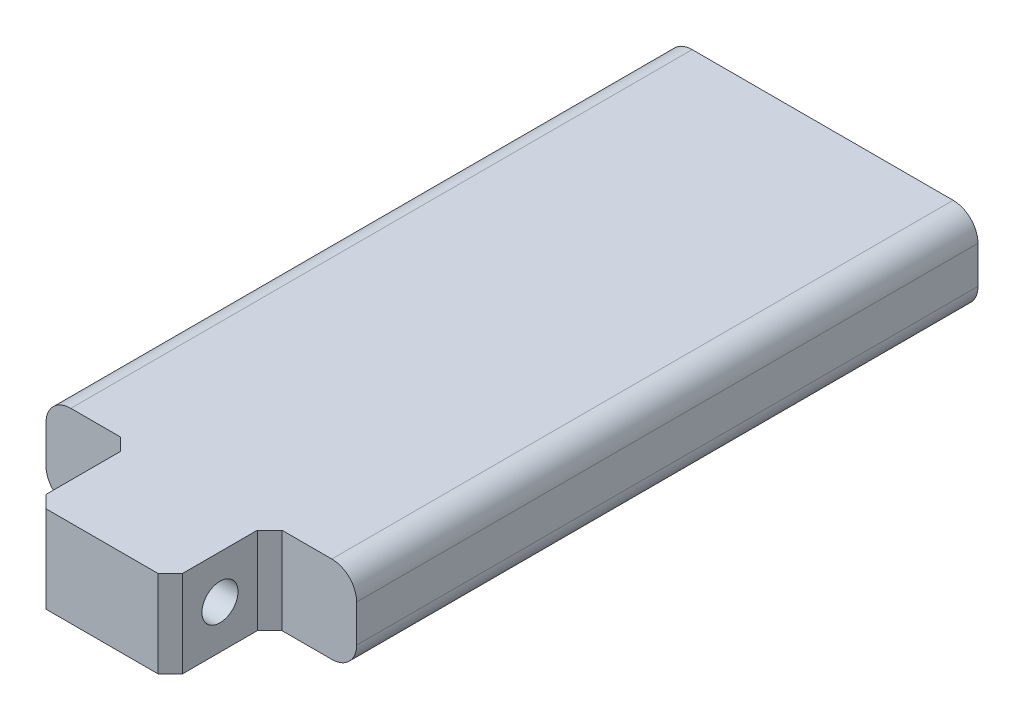
ISO-10303-21;
HEADER;
FILE_DESCRIPTION(('STEP AP214'),'2;1');
FILE_NAME('part.step','',(''),(''),'','','');
FILE_SCHEMA(('AUTOMOTIVE_DESIGN { 1 0 10303 214 1 1 1 1 }'));
ENDSEC;
DATA;
#1=APPLICATION_CONTEXT('core data for automotive mechanical design processes');
#2=APPLICATION_PROTOCOL_DEFINITION('international standard','automotive_design',2000,#1);
#3=PRODUCT_CONTEXT('',#1,'mechanical');
#4=PRODUCT('Part','Part','',(#3));
#5=PRODUCT_RELATED_PRODUCT_CATEGORY('part','',(#4));
#6=PRODUCT_DEFINITION_FORMATION('','',#4);
#7=PRODUCT_DEFINITION_CONTEXT('part definition',#1,'design');
#8=PRODUCT_DEFINITION('design','',#6,#7);
#9=PRODUCT_DEFINITION_SHAPE('','',#8);
#10=(LENGTH_UNIT() NAMED_UNIT(*) SI_UNIT(.MILLI.,.METRE.));
#11=(NAMED_UNIT(*) PLANE_ANGLE_UNIT() SI_UNIT($,.RADIAN.));
#12=(NAMED_UNIT(*) SI_UNIT($,.STERADIAN.) SOLID_ANGLE_UNIT());
#13=UNCERTAINTY_MEASURE_WITH_UNIT(LENGTH_MEASURE(1.E-05),#10,'distance_accuracy_value','');
#14=(GEOMETRIC_REPRESENTATION_CONTEXT(3) GLOBAL_UNCERTAINTY_ASSIGNED_CONTEXT((#13)) GLOBAL_UNIT_ASSIGNED_CONTEXT((#10,
#11,#12)) REPRESENTATION_CONTEXT('',''));
#15=CARTESIAN_POINT('',(0.,0.,0.));
#16=DIRECTION('',(0.,0.,1.));
#17=DIRECTION('',(1.,0.,0.));
#18=AXIS2_PLACEMENT_3D('',#15,#16,#17);
#19=CARTESIAN_POINT('',(12.5,-3.5,58.));
#20=DIRECTION('',(-1.,0.,0.));
#21=DIRECTION('',(0.,0.,1.));
#22=AXIS2_PLACEMENT_3D('',#19,#20,#21);
#23=PLANE('',#22);
#24=DIRECTION('',(0.,1.,0.));
#25=VECTOR('',#24,1.);
#26=CARTESIAN_POINT('',(12.5,-3.5,0.));
#27=LINE('',#26,#25);
#28=CARTESIAN_POINT('',(12.5,-1.5,0.));
#29=VERTEX_POINT('',#28);
#30=CARTESIAN_POINT('',(12.5,1.5,0.));
#31=VERTEX_POINT('',#30);
#32=EDGE_CURVE('E201',#29,#31,#27,.T.);
#33=ORIENTED_EDGE('',*,*,#32,.T.);
#34=DIRECTION('',(0.,0.,-1.));
#35=VECTOR('',#34,1.);
#36=CARTESIAN_POINT('',(12.5,1.5,58.));
#37=LINE('',#36,#35);
#38=CARTESIAN_POINT('',(12.5,1.5,50.));
#39=VERTEX_POINT('',#38);
#40=EDGE_CURVE('E256',#31,#39,#37,.F.);
#41=ORIENTED_EDGE('',*,*,#40,.T.);
#42=DIRECTION('',(0.,1.,0.));
#43=VECTOR('',#42,1.);
#44=CARTESIAN_POINT('',(12.5,-3.5,50.));
#45=LINE('',#44,#43);
#46=CARTESIAN_POINT('',(12.5,-1.5,50.));
#47=VERTEX_POINT('',#46);
#48=EDGE_CURVE('E184',#47,#39,#45,.T.);
#49=ORIENTED_EDGE('',*,*,#48,.F.);
#50=DIRECTION('',(0.,0.,-1.));
#51=VECTOR('',#50,1.);
#52=CARTESIAN_POINT('',(12.5,-1.5,58.));
#53=LINE('',#52,#51);
#54=EDGE_CURVE('E253',#47,#29,#53,.T.);
#55=ORIENTED_EDGE('',*,*,#54,.T.);
#56=EDGE_LOOP('',(#33,#41,#49,#55));
#57=FACE_BOUND('',#56,.T.);
#58=ADVANCED_FACE('F37',(#57),#23,.F.);
#59=CARTESIAN_POINT('',(-12.5,3.5,58.));
#60=DIRECTION('',(0.,-1.,0.));
#61=DIRECTION('',(0.,0.,-1.));
#62=AXIS2_PLACEMENT_3D('',#59,#60,#61);
#63=PLANE('',#62);
#64=DIRECTION('',(-1.,0.,0.));
#65=VECTOR('',#64,1.);
#66=CARTESIAN_POINT('',(12.5,3.5,50.));
#67=LINE('',#66,#65);
#68=CARTESIAN_POINT('',(10.5,3.5,50.));
#69=VERTEX_POINT('',#68);
#70=CARTESIAN_POINT('',(6.5,3.5,50.));
#71=VERTEX_POINT('',#70);
#72=EDGE_CURVE('E177',#69,#71,#67,.T.);
#73=ORIENTED_EDGE('',*,*,#72,.F.);
#74=DIRECTION('',(0.,0.,-1.));
#75=VECTOR('',#74,1.);
#76=CARTESIAN_POINT('',(10.5,3.5,58.));
#77=LINE('',#76,#75);
#78=CARTESIAN_POINT('',(10.5,3.5,0.));
#79=VERTEX_POINT('',#78);
#80=EDGE_CURVE('E242',#69,#79,#77,.T.);
#81=ORIENTED_EDGE('',*,*,#80,.T.);
#82=DIRECTION('',(-1.,0.,0.));
#83=VECTOR('',#82,1.);
#84=CARTESIAN_POINT('',(-12.5,3.5,0.));
#85=LINE('',#84,#83);
#86=CARTESIAN_POINT('',(-10.5,3.5,0.));
#87=VERTEX_POINT('',#86);
#88=EDGE_CURVE('E212',#79,#87,#85,.T.);
#89=ORIENTED_EDGE('',*,*,#88,.T.);
#90=DIRECTION('',(0.,0.,-1.));
#91=VECTOR('',#90,1.);
#92=CARTESIAN_POINT('',(-10.5,3.5,58.));
#93=LINE('',#92,#91);
#94=CARTESIAN_POINT('',(-10.5,3.5,50.));
#95=VERTEX_POINT('',#94);
#96=EDGE_CURVE('E239',#87,#95,#93,.F.);
#97=ORIENTED_EDGE('',*,*,#96,.T.);
#98=DIRECTION('',(-1.,0.,0.));
#99=VECTOR('',#98,1.);
#100=CARTESIAN_POINT('',(-12.5,3.5,50.));
#101=LINE('',#100,#99);
#102=CARTESIAN_POINT('',(-6.50000000000001,3.5,50.));
#103=VERTEX_POINT('',#102);
#104=EDGE_CURVE('E194',#103,#95,#101,.T.);
#105=ORIENTED_EDGE('',*,*,#104,.F.);
#106=DIRECTION('',(-0.707106781186547,0.,-0.707106781186547));
#107=VECTOR('',#106,1.);
#108=CARTESIAN_POINT('',(-5.5,3.5,51.));
#109=LINE('',#108,#107);
#110=CARTESIAN_POINT('',(-5.5,3.5,51.));
#111=VERTEX_POINT('',#110);
#112=EDGE_CURVE('E45',#103,#111,#109,.F.);
#113=ORIENTED_EDGE('',*,*,#112,.T.);
#114=DIRECTION('',(0.,0.,-1.));
#115=VECTOR('',#114,1.);
#116=CARTESIAN_POINT('',(-5.5,3.5,58.));
#117=LINE('',#116,#115);
#118=CARTESIAN_POINT('',(-5.5,3.5,57.));
#119=VERTEX_POINT('',#118);
#120=EDGE_CURVE('E190',#119,#111,#117,.T.);
#121=ORIENTED_EDGE('',*,*,#120,.F.);
#122=DIRECTION('',(-0.707106781186553,0.,-0.707106781186543));
#123=VECTOR('',#122,1.);
#124=CARTESIAN_POINT('',(-5.5,3.5,57.));
#125=LINE('',#124,#123);
#126=CARTESIAN_POINT('',(-4.49999999999999,3.5,58.));
#127=VERTEX_POINT('',#126);
#128=EDGE_CURVE('E224',#119,#127,#125,.F.);
#129=ORIENTED_EDGE('',*,*,#128,.T.);
#130=DIRECTION('',(-1.,0.,0.));
#131=VECTOR('',#130,1.);
#132=CARTESIAN_POINT('',(-12.5,3.5,58.));
#133=LINE('',#132,#131);
#134=CARTESIAN_POINT('',(4.50000000000001,3.5,58.));
#135=VERTEX_POINT('',#134);
#136=EDGE_CURVE('E202',#135,#127,#133,.T.);
#137=ORIENTED_EDGE('',*,*,#136,.F.);
#138=DIRECTION('',(-0.707106781186545,0.,0.70710678118655));
#139=VECTOR('',#138,1.);
#140=CARTESIAN_POINT('',(4.50000000000001,3.5,58.));
#141=LINE('',#140,#139);
#142=CARTESIAN_POINT('',(5.5,3.5,57.));
#143=VERTEX_POINT('',#142);
#144=EDGE_CURVE('E226',#135,#143,#141,.F.);
#145=ORIENTED_EDGE('',*,*,#144,.T.);
#146=DIRECTION('',(0.,0.,1.));
#147=VECTOR('',#146,1.);
#148=CARTESIAN_POINT('',(5.5,3.5,58.));
#149=LINE('',#148,#147);
#150=CARTESIAN_POINT('',(5.5,3.5,51.));
#151=VERTEX_POINT('',#150);
#152=EDGE_CURVE('E182',#151,#143,#149,.T.);
#153=ORIENTED_EDGE('',*,*,#152,.F.);
#154=DIRECTION('',(-0.707106781186543,0.,0.707106781186553));
#155=VECTOR('',#154,1.);
#156=CARTESIAN_POINT('',(-6.99999999999986,3.5,63.5000000000001));
#157=LINE('',#156,#155);
#158=EDGE_CURVE('E286',#151,#71,#157,.F.);
#159=ORIENTED_EDGE('',*,*,#158,.T.);
#160=EDGE_LOOP('',(#73,#81,#89,#97,#105,#113,#121,#129,#137,#145,#153,#159));
#161=FACE_BOUND('',#160,.T.);
#162=ADVANCED_FACE('F304',(#161),#63,.F.);
#163=CARTESIAN_POINT('',(-12.5,-3.5,58.));
#164=DIRECTION('',(1.,0.,0.));
#165=DIRECTION('',(0.,0.,-1.));
#166=AXIS2_PLACEMENT_3D('',#163,#164,#165);
#167=PLANE('',#166);
#168=DIRECTION('',(0.,1.,0.));
#169=VECTOR('',#168,1.);
#170=CARTESIAN_POINT('',(-12.5,-3.5,50.));
#171=LINE('',#170,#169);
#172=CARTESIAN_POINT('',(-12.5,-1.5,50.));
#173=VERTEX_POINT('',#172);
#174=CARTESIAN_POINT('',(-12.5,1.5,50.));
#175=VERTEX_POINT('',#174);
#176=EDGE_CURVE('E196',#173,#175,#171,.T.);
#177=ORIENTED_EDGE('',*,*,#176,.T.);
#178=DIRECTION('',(0.,0.,-1.));
#179=VECTOR('',#178,1.);
#180=CARTESIAN_POINT('',(-12.5,1.5,58.));
#181=LINE('',#180,#179);
#182=CARTESIAN_POINT('',(-12.5,1.5,0.));
#183=VERTEX_POINT('',#182);
#184=EDGE_CURVE('E269',#175,#183,#181,.T.);
#185=ORIENTED_EDGE('',*,*,#184,.T.);
#186=DIRECTION('',(0.,-1.,0.));
#187=VECTOR('',#186,1.);
#188=CARTESIAN_POINT('',(-12.5,-3.5,0.));
#189=LINE('',#188,#187);
#190=CARTESIAN_POINT('',(-12.5,-1.5,0.));
#191=VERTEX_POINT('',#190);
#192=EDGE_CURVE('E215',#183,#191,#189,.T.);
#193=ORIENTED_EDGE('',*,*,#192,.T.);
#194=DIRECTION('',(0.,0.,-1.));
#195=VECTOR('',#194,1.);
#196=CARTESIAN_POINT('',(-12.5,-1.5,58.));
#197=LINE('',#196,#195);
#198=EDGE_CURVE('E267',#191,#173,#197,.F.);
#199=ORIENTED_EDGE('',*,*,#198,.T.);
#200=EDGE_LOOP('',(#177,#185,#193,#199));
#201=FACE_BOUND('',#200,.T.);
#202=ADVANCED_FACE('F324',(#201),#167,.F.);
#203=CARTESIAN_POINT('',(-12.5,-3.5,58.));
#204=DIRECTION('',(0.,1.,0.));
#205=DIRECTION('',(0.,0.,1.));
#206=AXIS2_PLACEMENT_3D('',#203,#204,#205);
#207=PLANE('',#206);
#208=DIRECTION('',(1.,0.,0.));
#209=VECTOR('',#208,1.);
#210=CARTESIAN_POINT('',(-12.5,-3.5,0.));
#211=LINE('',#210,#209);
#212=CARTESIAN_POINT('',(-10.5,-3.5,0.));
#213=VERTEX_POINT('',#212);
#214=CARTESIAN_POINT('',(10.5,-3.5,0.));
#215=VERTEX_POINT('',#214);
#216=EDGE_CURVE('E206',#213,#215,#211,.T.);
#217=ORIENTED_EDGE('',*,*,#216,.T.);
#218=DIRECTION('',(0.,0.,-1.));
#219=VECTOR('',#218,1.);
#220=CARTESIAN_POINT('',(10.5,-3.5,58.));
#221=LINE('',#220,#219);
#222=CARTESIAN_POINT('',(10.5,-3.5,50.));
#223=VERTEX_POINT('',#222);
#224=EDGE_CURVE('E265',#215,#223,#221,.F.);
#225=ORIENTED_EDGE('',*,*,#224,.T.);
#226=DIRECTION('',(-1.,0.,0.));
#227=VECTOR('',#226,1.);
#228=CARTESIAN_POINT('',(12.5,-3.5,50.));
#229=LINE('',#228,#227);
#230=CARTESIAN_POINT('',(6.5,-3.5,50.));
#231=VERTEX_POINT('',#230);
#232=EDGE_CURVE('E178',#223,#231,#229,.T.);
#233=ORIENTED_EDGE('',*,*,#232,.T.);
#234=DIRECTION('',(0.707106781186543,0.,-0.707106781186553));
#235=VECTOR('',#234,1.);
#236=CARTESIAN_POINT('',(-6.99999999999986,-3.5,63.5000000000001));
#237=LINE('',#236,#235);
#238=CARTESIAN_POINT('',(5.5,-3.5,51.));
#239=VERTEX_POINT('',#238);
#240=EDGE_CURVE('E288',#231,#239,#237,.F.);
#241=ORIENTED_EDGE('',*,*,#240,.T.);
#242=DIRECTION('',(0.,0.,1.));
#243=VECTOR('',#242,1.);
#244=CARTESIAN_POINT('',(5.5,-3.5,58.));
#245=LINE('',#244,#243);
#246=CARTESIAN_POINT('',(5.5,-3.5,57.));
#247=VERTEX_POINT('',#246);
#248=EDGE_CURVE('E181',#239,#247,#245,.T.);
#249=ORIENTED_EDGE('',*,*,#248,.T.);
#250=DIRECTION('',(0.707106781186545,0.,-0.70710678118655));
#251=VECTOR('',#250,1.);
#252=CARTESIAN_POINT('',(4.50000000000001,-3.5,58.));
#253=LINE('',#252,#251);
#254=CARTESIAN_POINT('',(4.50000000000001,-3.5,58.));
#255=VERTEX_POINT('',#254);
#256=EDGE_CURVE('E234',#247,#255,#253,.F.);
#257=ORIENTED_EDGE('',*,*,#256,.T.);
#258=DIRECTION('',(1.,0.,0.));
#259=VECTOR('',#258,1.);
#260=CARTESIAN_POINT('',(-12.5,-3.5,58.));
#261=LINE('',#260,#259);
#262=CARTESIAN_POINT('',(-4.49999999999999,-3.5,58.));
#263=VERTEX_POINT('',#262);
#264=EDGE_CURVE('E205',#263,#255,#261,.T.);
#265=ORIENTED_EDGE('',*,*,#264,.F.);
#266=DIRECTION('',(0.707106781186553,0.,0.707106781186543));
#267=VECTOR('',#266,1.);
#268=CARTESIAN_POINT('',(-5.5,-3.5,57.));
#269=LINE('',#268,#267);
#270=CARTESIAN_POINT('',(-5.5,-3.5,57.));
#271=VERTEX_POINT('',#270);
#272=EDGE_CURVE('E232',#263,#271,#269,.F.);
#273=ORIENTED_EDGE('',*,*,#272,.T.);
#274=DIRECTION('',(0.,0.,-1.));
#275=VECTOR('',#274,1.);
#276=CARTESIAN_POINT('',(-5.5,-3.5,58.));
#277=LINE('',#276,#275);
#278=CARTESIAN_POINT('',(-5.5,-3.5,51.));
#279=VERTEX_POINT('',#278);
#280=EDGE_CURVE('E191',#271,#279,#277,.T.);
#281=ORIENTED_EDGE('',*,*,#280,.T.);
#282=DIRECTION('',(0.707106781186547,0.,0.707106781186547));
#283=VECTOR('',#282,1.);
#284=CARTESIAN_POINT('',(-5.5,-3.5,51.));
#285=LINE('',#284,#283);
#286=CARTESIAN_POINT('',(-6.50000000000001,-3.5,50.));
#287=VERTEX_POINT('',#286);
#288=EDGE_CURVE('E11',#279,#287,#285,.F.);
#289=ORIENTED_EDGE('',*,*,#288,.T.);
#290=DIRECTION('',(-1.,0.,0.));
#291=VECTOR('',#290,1.);
#292=CARTESIAN_POINT('',(-12.5,-3.5,50.));
#293=LINE('',#292,#291);
#294=CARTESIAN_POINT('',(-10.5,-3.5,50.));
#295=VERTEX_POINT('',#294);
#296=EDGE_CURVE('E193',#287,#295,#293,.T.);
#297=ORIENTED_EDGE('',*,*,#296,.T.);
#298=DIRECTION('',(0.,0.,-1.));
#299=VECTOR('',#298,1.);
#300=CARTESIAN_POINT('',(-10.5,-3.5,58.));
#301=LINE('',#300,#299);
#302=EDGE_CURVE('E262',#295,#213,#301,.T.);
#303=ORIENTED_EDGE('',*,*,#302,.T.);
#304=EDGE_LOOP('',(#217,#225,#233,#241,#249,#257,#265,#273,#281,#289,#297,#303));
#305=FACE_BOUND('',#304,.T.);
#306=ADVANCED_FACE('F292',(#305),#207,.F.);
#307=CARTESIAN_POINT('',(0.,0.,58.));
#308=DIRECTION('',(0.,0.,-1.));
#309=DIRECTION('',(-1.,0.,0.));
#310=AXIS2_PLACEMENT_3D('',#307,#308,#309);
#311=PLANE('',#310);
#312=ORIENTED_EDGE('',*,*,#264,.T.);
#313=DIRECTION('',(0.,1.,0.));
#314=VECTOR('',#313,1.);
#315=CARTESIAN_POINT('',(4.50000000000001,0.,58.));
#316=LINE('',#315,#314);
#317=EDGE_CURVE('E221',#255,#135,#316,.T.);
#318=ORIENTED_EDGE('',*,*,#317,.T.);
#319=ORIENTED_EDGE('',*,*,#136,.T.);
#320=DIRECTION('',(0.,-1.,0.));
#321=VECTOR('',#320,1.);
#322=CARTESIAN_POINT('',(-4.49999999999999,0.,58.));
#323=LINE('',#322,#321);
#324=EDGE_CURVE('E209',#127,#263,#323,.T.);
#325=ORIENTED_EDGE('',*,*,#324,.T.);
#326=EDGE_LOOP('',(#312,#318,#319,#325));
#327=FACE_BOUND('',#326,.T.);
#328=ADVANCED_FACE('F381',(#327),#311,.F.);
#329=CARTESIAN_POINT('',(0.,0.,0.));
#330=DIRECTION('',(0.,0.,-1.));
#331=DIRECTION('',(-1.,0.,0.));
#332=AXIS2_PLACEMENT_3D('',#329,#330,#331);
#333=PLANE('',#332);
#334=CARTESIAN_POINT('',(7.,0.,0.));
#335=DIRECTION('',(0.,0.,-1.));
#336=DIRECTION('',(-1.,0.,0.));
#337=AXIS2_PLACEMENT_3D('',#334,#335,#336);
#338=CIRCLE('',#337,1.5);
#339=CARTESIAN_POINT('',(5.5,0.,0.));
#340=VERTEX_POINT('',#339);
#341=EDGE_CURVE('E165',#340,#340,#338,.T.);
#342=ORIENTED_EDGE('',*,*,#341,.F.);
#343=EDGE_LOOP('',(#342));
#344=FACE_BOUND('',#343,.T.);
#345=CARTESIAN_POINT('',(-7.,0.,0.));
#346=DIRECTION('',(0.,0.,-1.));
#347=DIRECTION('',(-1.,0.,0.));
#348=AXIS2_PLACEMENT_3D('',#345,#346,#347);
#349=CIRCLE('',#348,1.5);
#350=CARTESIAN_POINT('',(-8.5,0.,0.));
#351=VERTEX_POINT('',#350);
#352=EDGE_CURVE('E164',#351,#351,#349,.T.);
#353=ORIENTED_EDGE('',*,*,#352,.F.);
#354=EDGE_LOOP('',(#353));
#355=FACE_BOUND('',#354,.T.);
#356=ORIENTED_EDGE('',*,*,#88,.F.);
#357=CARTESIAN_POINT('',(10.5,1.5,0.));
#358=DIRECTION('',(0.,0.,-1.));
#359=DIRECTION('',(-1.,0.,0.));
#360=AXIS2_PLACEMENT_3D('',#357,#358,#359);
#361=CIRCLE('',#360,2.);
#362=EDGE_CURVE('E251',#79,#31,#361,.T.);
#363=ORIENTED_EDGE('',*,*,#362,.T.);
#364=ORIENTED_EDGE('',*,*,#32,.F.);
#365=CARTESIAN_POINT('',(10.5,-1.5,0.));
#366=DIRECTION('',(0.,0.,-1.));
#367=DIRECTION('',(-1.,0.,0.));
#368=AXIS2_PLACEMENT_3D('',#365,#366,#367);
#369=CIRCLE('',#368,2.);
#370=EDGE_CURVE('E249',#29,#215,#369,.T.);
#371=ORIENTED_EDGE('',*,*,#370,.T.);
#372=ORIENTED_EDGE('',*,*,#216,.F.);
#373=CARTESIAN_POINT('',(-10.5,-1.5,0.));
#374=DIRECTION('',(0.,0.,-1.));
#375=DIRECTION('',(-1.,0.,0.));
#376=AXIS2_PLACEMENT_3D('',#373,#374,#375);
#377=CIRCLE('',#376,2.);
#378=EDGE_CURVE('E245',#213,#191,#377,.T.);
#379=ORIENTED_EDGE('',*,*,#378,.T.);
#380=ORIENTED_EDGE('',*,*,#192,.F.);
#381=CARTESIAN_POINT('',(-10.5,1.5,0.));
#382=DIRECTION('',(0.,0.,-1.));
#383=DIRECTION('',(-1.,0.,0.));
#384=AXIS2_PLACEMENT_3D('',#381,#382,#383);
#385=CIRCLE('',#384,2.);
#386=EDGE_CURVE('E247',#183,#87,#385,.T.);
#387=ORIENTED_EDGE('',*,*,#386,.T.);
#388=EDGE_LOOP('',(#356,#363,#364,#371,#372,#379,#380,#387));
#389=FACE_BOUND('',#388,.T.);
#390=ADVANCED_FACE('F316',(#344,#355,#389),#333,.T.);
#391=CARTESIAN_POINT('',(-12.5,-3.5,50.));
#392=DIRECTION('',(0.,0.,-1.));
#393=DIRECTION('',(-1.,0.,0.));
#394=AXIS2_PLACEMENT_3D('',#391,#392,#393);
#395=PLANE('',#394);
#396=ORIENTED_EDGE('',*,*,#296,.F.);
#397=DIRECTION('',(0.,1.,0.));
#398=VECTOR('',#397,1.);
#399=CARTESIAN_POINT('',(-6.50000000000001,3.5,50.));
#400=LINE('',#399,#398);
#401=EDGE_CURVE('E282',#287,#103,#400,.T.);
#402=ORIENTED_EDGE('',*,*,#401,.T.);
#403=ORIENTED_EDGE('',*,*,#104,.T.);
#404=CARTESIAN_POINT('',(-10.5,1.5,50.));
#405=DIRECTION('',(0.,0.,-1.));
#406=DIRECTION('',(-1.,0.,0.));
#407=AXIS2_PLACEMENT_3D('',#404,#405,#406);
#408=CIRCLE('',#407,2.);
#409=EDGE_CURVE('E275',#95,#175,#408,.F.);
#410=ORIENTED_EDGE('',*,*,#409,.T.);
#411=ORIENTED_EDGE('',*,*,#176,.F.);
#412=CARTESIAN_POINT('',(-10.5,-1.5,50.));
#413=DIRECTION('',(0.,0.,-1.));
#414=DIRECTION('',(-1.,0.,0.));
#415=AXIS2_PLACEMENT_3D('',#412,#413,#414);
#416=CIRCLE('',#415,2.);
#417=EDGE_CURVE('E272',#173,#295,#416,.F.);
#418=ORIENTED_EDGE('',*,*,#417,.T.);
#419=EDGE_LOOP('',(#396,#402,#403,#410,#411,#418));
#420=FACE_BOUND('',#419,.T.);
#421=ADVANCED_FACE('F330',(#420),#395,.F.);
#422=CARTESIAN_POINT('',(-5.5,-3.5,58.));
#423=DIRECTION('',(1.,0.,0.));
#424=DIRECTION('',(0.,0.,-1.));
#425=AXIS2_PLACEMENT_3D('',#422,#423,#424);
#426=PLANE('',#425);
#427=CARTESIAN_POINT('',(-5.50000000000037,0.,53.9999999999999));
#428=DIRECTION('',(-1.,0.,0.));
#429=DIRECTION('',(0.,0.,1.));
#430=AXIS2_PLACEMENT_3D('',#427,#428,#429);
#431=CIRCLE('',#430,1.45);
#432=CARTESIAN_POINT('',(-5.50000000000037,0.,55.4499999999999));
#433=VERTEX_POINT('',#432);
#434=EDGE_CURVE('E563',#433,#433,#431,.T.);
#435=ORIENTED_EDGE('',*,*,#434,.F.);
#436=EDGE_LOOP('',(#435));
#437=FACE_BOUND('',#436,.T.);
#438=ORIENTED_EDGE('',*,*,#120,.T.);
#439=DIRECTION('',(0.,-1.,0.));
#440=VECTOR('',#439,1.);
#441=CARTESIAN_POINT('',(-5.5,-3.5,51.));
#442=LINE('',#441,#440);
#443=EDGE_CURVE('E58',#111,#279,#442,.T.);
#444=ORIENTED_EDGE('',*,*,#443,.T.);
#445=ORIENTED_EDGE('',*,*,#280,.F.);
#446=DIRECTION('',(0.,1.,0.));
#447=VECTOR('',#446,1.);
#448=CARTESIAN_POINT('',(-5.5,-3.5,57.));
#449=LINE('',#448,#447);
#450=EDGE_CURVE('E236',#271,#119,#449,.T.);
#451=ORIENTED_EDGE('',*,*,#450,.T.);
#452=EDGE_LOOP('',(#438,#444,#445,#451));
#453=FACE_BOUND('',#452,.T.);
#454=ADVANCED_FACE('F377',(#437,#453),#426,.F.);
#455=CARTESIAN_POINT('',(5.5,-3.5,58.));
#456=DIRECTION('',(-1.,0.,0.));
#457=DIRECTION('',(0.,0.,1.));
#458=AXIS2_PLACEMENT_3D('',#455,#456,#457);
#459=PLANE('',#458);
#460=CARTESIAN_POINT('',(5.5,0.,53.9999999999999));
#461=DIRECTION('',(-1.,0.,0.));
#462=DIRECTION('',(0.,0.,1.));
#463=AXIS2_PLACEMENT_3D('',#460,#461,#462);
#464=CIRCLE('',#463,1.45);
#465=CARTESIAN_POINT('',(5.5,0.,55.4499999999999));
#466=VERTEX_POINT('',#465);
#467=EDGE_CURVE('E171',#466,#466,#464,.T.);
#468=ORIENTED_EDGE('',*,*,#467,.T.);
#469=EDGE_LOOP('',(#468));
#470=FACE_BOUND('',#469,.T.);
#471=ORIENTED_EDGE('',*,*,#248,.F.);
#472=DIRECTION('',(0.,1.,0.));
#473=VECTOR('',#472,1.);
#474=CARTESIAN_POINT('',(5.5,3.5,51.));
#475=LINE('',#474,#473);
#476=EDGE_CURVE('E277',#239,#151,#475,.T.);
#477=ORIENTED_EDGE('',*,*,#476,.T.);
#478=ORIENTED_EDGE('',*,*,#152,.T.);
#479=DIRECTION('',(0.,-1.,0.));
#480=VECTOR('',#479,1.);
#481=CARTESIAN_POINT('',(5.5,-3.5,57.));
#482=LINE('',#481,#480);
#483=EDGE_CURVE('E229',#143,#247,#482,.T.);
#484=ORIENTED_EDGE('',*,*,#483,.T.);
#485=EDGE_LOOP('',(#471,#477,#478,#484));
#486=FACE_BOUND('',#485,.T.);
#487=ADVANCED_FACE('F298',(#470,#486),#459,.F.);
#488=CARTESIAN_POINT('',(12.5,-3.5,50.));
#489=DIRECTION('',(0.,0.,-1.));
#490=DIRECTION('',(-1.,0.,0.));
#491=AXIS2_PLACEMENT_3D('',#488,#489,#490);
#492=PLANE('',#491);
#493=ORIENTED_EDGE('',*,*,#72,.T.);
#494=DIRECTION('',(0.,-1.,0.));
#495=VECTOR('',#494,1.);
#496=CARTESIAN_POINT('',(6.5,-3.5,50.));
#497=LINE('',#496,#495);
#498=EDGE_CURVE('E280',#71,#231,#497,.T.);
#499=ORIENTED_EDGE('',*,*,#498,.T.);
#500=ORIENTED_EDGE('',*,*,#232,.F.);
#501=CARTESIAN_POINT('',(10.5,-1.5,50.));
#502=DIRECTION('',(0.,0.,-1.));
#503=DIRECTION('',(-1.,0.,0.));
#504=AXIS2_PLACEMENT_3D('',#501,#502,#503);
#505=CIRCLE('',#504,2.);
#506=EDGE_CURVE('E258',#223,#47,#505,.F.);
#507=ORIENTED_EDGE('',*,*,#506,.T.);
#508=ORIENTED_EDGE('',*,*,#48,.T.);
#509=CARTESIAN_POINT('',(10.5,1.5,50.));
#510=DIRECTION('',(0.,0.,-1.));
#511=DIRECTION('',(-1.,0.,0.));
#512=AXIS2_PLACEMENT_3D('',#509,#510,#511);
#513=CIRCLE('',#512,2.);
#514=EDGE_CURVE('E260',#39,#69,#513,.F.);
#515=ORIENTED_EDGE('',*,*,#514,.T.);
#516=EDGE_LOOP('',(#493,#499,#500,#507,#508,#515));
#517=FACE_BOUND('',#516,.T.);
#518=ADVANCED_FACE('F307',(#517),#492,.F.);
#519=CARTESIAN_POINT('',(-7.,0.,7.5));
#520=DIRECTION('',(0.,0.,-1.));
#521=DIRECTION('',(-1.,0.,0.));
#522=AXIS2_PLACEMENT_3D('',#519,#520,#521);
#523=CONICAL_SURFACE('',#522,1.5,1.02974425867665);
#524=CARTESIAN_POINT('',(-7.,0.,8.40129092854134));
#525=VERTEX_POINT('',#524);
#526=VERTEX_LOOP('',#525);
#527=FACE_BOUND('',#526,.T.);
#528=CARTESIAN_POINT('',(-7.,0.,7.5));
#529=DIRECTION('',(0.,0.,-1.));
#530=DIRECTION('',(-1.,0.,0.));
#531=AXIS2_PLACEMENT_3D('',#528,#529,#530);
#532=CIRCLE('',#531,1.5);
#533=CARTESIAN_POINT('',(-8.5,0.,7.5));
#534=VERTEX_POINT('',#533);
#535=EDGE_CURVE('E168',#534,#534,#532,.T.);
#536=ORIENTED_EDGE('',*,*,#535,.T.);
#537=EDGE_LOOP('',(#536));
#538=FACE_BOUND('',#537,.T.);
#539=ADVANCED_FACE('F441',(#527,#538),#523,.F.);
#540=CARTESIAN_POINT('',(-7.,0.,0.));
#541=DIRECTION('',(0.,0.,-1.));
#542=DIRECTION('',(-1.,0.,0.));
#543=AXIS2_PLACEMENT_3D('',#540,#541,#542);
#544=CYLINDRICAL_SURFACE('',#543,1.5);
#545=ORIENTED_EDGE('',*,*,#535,.F.);
#546=EDGE_LOOP('',(#545));
#547=FACE_BOUND('',#546,.T.);
#548=ORIENTED_EDGE('',*,*,#352,.T.);
#549=EDGE_LOOP('',(#548));
#550=FACE_BOUND('',#549,.T.);
#551=ADVANCED_FACE('F158',(#547,#550),#544,.F.);
#552=CARTESIAN_POINT('',(7.,0.,7.5));
#553=DIRECTION('',(0.,0.,-1.));
#554=DIRECTION('',(-1.,0.,0.));
#555=AXIS2_PLACEMENT_3D('',#552,#553,#554);
#556=CONICAL_SURFACE('',#555,1.5,1.02974425867665);
#557=CARTESIAN_POINT('',(7.,0.,8.40129092854134));
#558=VERTEX_POINT('',#557);
#559=VERTEX_LOOP('',#558);
#560=FACE_BOUND('',#559,.T.);
#561=CARTESIAN_POINT('',(7.,0.,7.5));
#562=DIRECTION('',(0.,0.,-1.));
#563=DIRECTION('',(-1.,0.,0.));
#564=AXIS2_PLACEMENT_3D('',#561,#562,#563);
#565=CIRCLE('',#564,1.5);
#566=CARTESIAN_POINT('',(5.5,0.,7.5));
#567=VERTEX_POINT('',#566);
#568=EDGE_CURVE('E162',#567,#567,#565,.T.);
#569=ORIENTED_EDGE('',*,*,#568,.T.);
#570=EDGE_LOOP('',(#569));
#571=FACE_BOUND('',#570,.T.);
#572=ADVANCED_FACE('F154',(#560,#571),#556,.F.);
#573=CARTESIAN_POINT('',(7.,0.,0.));
#574=DIRECTION('',(0.,0.,-1.));
#575=DIRECTION('',(-1.,0.,0.));
#576=AXIS2_PLACEMENT_3D('',#573,#574,#575);
#577=CYLINDRICAL_SURFACE('',#576,1.5);
#578=ORIENTED_EDGE('',*,*,#568,.F.);
#579=EDGE_LOOP('',(#578));
#580=FACE_BOUND('',#579,.T.);
#581=ORIENTED_EDGE('',*,*,#341,.T.);
#582=EDGE_LOOP('',(#581));
#583=FACE_BOUND('',#582,.T.);
#584=ADVANCED_FACE('F157',(#580,#583),#577,.F.);
#585=CARTESIAN_POINT('',(4.50000000000001,0.,58.));
#586=DIRECTION('',(-0.70710678118655,0.,-0.707106781186545));
#587=DIRECTION('',(0.,1.,0.));
#588=AXIS2_PLACEMENT_3D('',#585,#586,#587);
#589=PLANE('',#588);
#590=ORIENTED_EDGE('',*,*,#256,.F.);
#591=ORIENTED_EDGE('',*,*,#483,.F.);
#592=ORIENTED_EDGE('',*,*,#144,.F.);
#593=ORIENTED_EDGE('',*,*,#317,.F.);
#594=EDGE_LOOP('',(#590,#591,#592,#593));
#595=FACE_BOUND('',#594,.T.);
#596=ADVANCED_FACE('F349',(#595),#589,.F.);
#597=CARTESIAN_POINT('',(-5.5,-3.5,57.));
#598=DIRECTION('',(0.707106781186542,0.,-0.707106781186552));
#599=DIRECTION('',(0.,1.,0.));
#600=AXIS2_PLACEMENT_3D('',#597,#598,#599);
#601=PLANE('',#600);
#602=ORIENTED_EDGE('',*,*,#272,.F.);
#603=ORIENTED_EDGE('',*,*,#324,.F.);
#604=ORIENTED_EDGE('',*,*,#128,.F.);
#605=ORIENTED_EDGE('',*,*,#450,.F.);
#606=EDGE_LOOP('',(#602,#603,#604,#605));
#607=FACE_BOUND('',#606,.T.);
#608=ADVANCED_FACE('F352',(#607),#601,.F.);
#609=CARTESIAN_POINT('',(-5.50000000000037,0.,53.9999999999999));
#610=DIRECTION('',(-1.,0.,0.));
#611=DIRECTION('',(0.,0.,1.));
#612=AXIS2_PLACEMENT_3D('',#609,#610,#611);
#613=CYLINDRICAL_SURFACE('',#612,1.45);
#614=ORIENTED_EDGE('',*,*,#434,.T.);
#615=EDGE_LOOP('',(#614));
#616=FACE_BOUND('',#615,.T.);
#617=ORIENTED_EDGE('',*,*,#467,.F.);
#618=EDGE_LOOP('',(#617));
#619=FACE_BOUND('',#618,.T.);
#620=ADVANCED_FACE('F356',(#616,#619),#613,.F.);
#621=CARTESIAN_POINT('',(10.5,1.5,58.));
#622=DIRECTION('',(0.,0.,-1.));
#623=DIRECTION('',(-1.,0.,0.));
#624=AXIS2_PLACEMENT_3D('',#621,#622,#623);
#625=CYLINDRICAL_SURFACE('',#624,2.);
#626=ORIENTED_EDGE('',*,*,#514,.F.);
#627=ORIENTED_EDGE('',*,*,#40,.F.);
#628=ORIENTED_EDGE('',*,*,#362,.F.);
#629=ORIENTED_EDGE('',*,*,#80,.F.);
#630=EDGE_LOOP('',(#626,#627,#628,#629));
#631=FACE_BOUND('',#630,.T.);
#632=ADVANCED_FACE('F312',(#631),#625,.T.);
#633=CARTESIAN_POINT('',(10.5,-1.5,58.));
#634=DIRECTION('',(0.,0.,-1.));
#635=DIRECTION('',(-1.,0.,0.));
#636=AXIS2_PLACEMENT_3D('',#633,#634,#635);
#637=CYLINDRICAL_SURFACE('',#636,2.);
#638=ORIENTED_EDGE('',*,*,#506,.F.);
#639=ORIENTED_EDGE('',*,*,#224,.F.);
#640=ORIENTED_EDGE('',*,*,#370,.F.);
#641=ORIENTED_EDGE('',*,*,#54,.F.);
#642=EDGE_LOOP('',(#638,#639,#640,#641));
#643=FACE_BOUND('',#642,.T.);
#644=ADVANCED_FACE('F339',(#643),#637,.T.);
#645=CARTESIAN_POINT('',(-10.5,1.5,58.));
#646=DIRECTION('',(0.,0.,-1.));
#647=DIRECTION('',(-1.,0.,0.));
#648=AXIS2_PLACEMENT_3D('',#645,#646,#647);
#649=CYLINDRICAL_SURFACE('',#648,2.);
#650=ORIENTED_EDGE('',*,*,#409,.F.);
#651=ORIENTED_EDGE('',*,*,#96,.F.);
#652=ORIENTED_EDGE('',*,*,#386,.F.);
#653=ORIENTED_EDGE('',*,*,#184,.F.);
#654=EDGE_LOOP('',(#650,#651,#652,#653));
#655=FACE_BOUND('',#654,.T.);
#656=ADVANCED_FACE('F322',(#655),#649,.T.);
#657=CARTESIAN_POINT('',(-10.5,-1.5,58.));
#658=DIRECTION('',(0.,0.,-1.));
#659=DIRECTION('',(-1.,0.,0.));
#660=AXIS2_PLACEMENT_3D('',#657,#658,#659);
#661=CYLINDRICAL_SURFACE('',#660,2.);
#662=ORIENTED_EDGE('',*,*,#417,.F.);
#663=ORIENTED_EDGE('',*,*,#198,.F.);
#664=ORIENTED_EDGE('',*,*,#378,.F.);
#665=ORIENTED_EDGE('',*,*,#302,.F.);
#666=EDGE_LOOP('',(#662,#663,#664,#665));
#667=FACE_BOUND('',#666,.T.);
#668=ADVANCED_FACE('F333',(#667),#661,.T.);
#669=CARTESIAN_POINT('',(5.5,-3.5,51.));
#670=DIRECTION('',(0.707106781186552,0.,0.707106781186542));
#671=DIRECTION('',(0.,-1.,0.));
#672=AXIS2_PLACEMENT_3D('',#669,#670,#671);
#673=PLANE('',#672);
#674=ORIENTED_EDGE('',*,*,#240,.F.);
#675=ORIENTED_EDGE('',*,*,#498,.F.);
#676=ORIENTED_EDGE('',*,*,#158,.F.);
#677=ORIENTED_EDGE('',*,*,#476,.F.);
#678=EDGE_LOOP('',(#674,#675,#676,#677));
#679=FACE_BOUND('',#678,.T.);
#680=ADVANCED_FACE('F302',(#679),#673,.T.);
#681=CARTESIAN_POINT('',(-6.50000000000001,-3.5,50.));
#682=DIRECTION('',(-0.707106781186547,0.,0.707106781186547));
#683=DIRECTION('',(0.,-1.,0.));
#684=AXIS2_PLACEMENT_3D('',#681,#682,#683);
#685=PLANE('',#684);
#686=ORIENTED_EDGE('',*,*,#288,.F.);
#687=ORIENTED_EDGE('',*,*,#443,.F.);
#688=ORIENTED_EDGE('',*,*,#112,.F.);
#689=ORIENTED_EDGE('',*,*,#401,.F.);
#690=EDGE_LOOP('',(#686,#687,#688,#689));
#691=FACE_BOUND('',#690,.T.);
#692=ADVANCED_FACE('F39',(#691),#685,.T.);
#693=CLOSED_SHELL('',(#58,#162,#202,#306,#328,#390,#421,#454,#487,#518,#539,#551,#572,#584,#596,
#608,#620,#632,#644,#656,#668,#680,#692));
#694=MANIFOLD_SOLID_BREP('B2',#693);
#695=ADVANCED_BREP_SHAPE_REPRESENTATION('',(#18,#694),#14);
#696=SHAPE_DEFINITION_REPRESENTATION(#9,#695);
ENDSEC;
END-ISO-10303-21;
